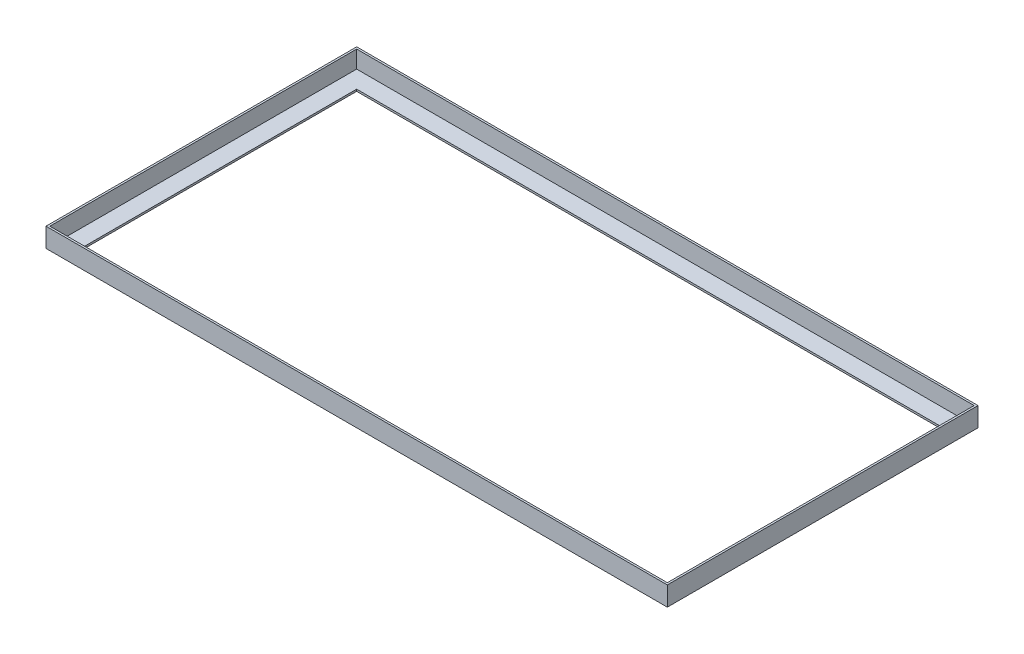
ISO-10303-21;
HEADER;
FILE_DESCRIPTION(('STEP AP214'),'2;1');
FILE_NAME('part.step','',(''),(''),'','','');
FILE_SCHEMA(('AUTOMOTIVE_DESIGN { 1 0 10303 214 1 1 1 1 }'));
ENDSEC;
DATA;
#1=APPLICATION_CONTEXT('core data for automotive mechanical design processes');
#2=APPLICATION_PROTOCOL_DEFINITION('international standard','automotive_design',2000,#1);
#3=PRODUCT_CONTEXT('',#1,'mechanical');
#4=PRODUCT('Part','Part','',(#3));
#5=PRODUCT_RELATED_PRODUCT_CATEGORY('part','',(#4));
#6=PRODUCT_DEFINITION_FORMATION('','',#4);
#7=PRODUCT_DEFINITION_CONTEXT('part definition',#1,'design');
#8=PRODUCT_DEFINITION('design','',#6,#7);
#9=PRODUCT_DEFINITION_SHAPE('','',#8);
#10=(LENGTH_UNIT() NAMED_UNIT(*) SI_UNIT(.MILLI.,.METRE.));
#11=(NAMED_UNIT(*) PLANE_ANGLE_UNIT() SI_UNIT($,.RADIAN.));
#12=(NAMED_UNIT(*) SI_UNIT($,.STERADIAN.) SOLID_ANGLE_UNIT());
#13=UNCERTAINTY_MEASURE_WITH_UNIT(LENGTH_MEASURE(1.E-05),#10,'distance_accuracy_value','');
#14=(GEOMETRIC_REPRESENTATION_CONTEXT(3) GLOBAL_UNCERTAINTY_ASSIGNED_CONTEXT((#13)) GLOBAL_UNIT_ASSIGNED_CONTEXT((#10,
#11,#12)) REPRESENTATION_CONTEXT('',''));
#15=CARTESIAN_POINT('',(0.,0.,0.));
#16=DIRECTION('',(0.,0.,1.));
#17=DIRECTION('',(1.,0.,0.));
#18=AXIS2_PLACEMENT_3D('',#15,#16,#17);
#19=CARTESIAN_POINT('',(0.,50.,-721.65604429409));
#20=DIRECTION('',(0.,0.,-1.));
#21=DIRECTION('',(-1.,0.,0.));
#22=AXIS2_PLACEMENT_3D('',#19,#20,#21);
#23=PLANE('',#22);
#24=DIRECTION('',(0.,-1.,0.));
#25=VECTOR('',#24,1.);
#26=CARTESIAN_POINT('',(-106.818181818182,50.,-721.65604429409));
#27=LINE('',#26,#25);
#28=CARTESIAN_POINT('',(-106.818181818182,50.,-721.65604429409));
#29=VERTEX_POINT('',#28);
#30=CARTESIAN_POINT('',(-106.818181818182,5.,-721.65604429409));
#31=VERTEX_POINT('',#30);
#32=EDGE_CURVE('E136',#29,#31,#27,.T.);
#33=ORIENTED_EDGE('',*,*,#32,.T.);
#34=DIRECTION('',(1.,0.,0.));
#35=VECTOR('',#34,1.);
#36=CARTESIAN_POINT('',(0.,5.,-721.65604429409));
#37=LINE('',#36,#35);
#38=CARTESIAN_POINT('',(1493.18181818182,5.,-721.65604429409));
#39=VERTEX_POINT('',#38);
#40=EDGE_CURVE('E51',#31,#39,#37,.T.);
#41=ORIENTED_EDGE('',*,*,#40,.T.);
#42=DIRECTION('',(0.,-1.,0.));
#43=VECTOR('',#42,1.);
#44=CARTESIAN_POINT('',(1493.18181818182,50.,-721.65604429409));
#45=LINE('',#44,#43);
#46=CARTESIAN_POINT('',(1493.18181818182,50.,-721.65604429409));
#47=VERTEX_POINT('',#46);
#48=EDGE_CURVE('E11',#47,#39,#45,.T.);
#49=ORIENTED_EDGE('',*,*,#48,.F.);
#50=DIRECTION('',(1.,0.,0.));
#51=VECTOR('',#50,1.);
#52=CARTESIAN_POINT('',(0.,50.,-721.65604429409));
#53=LINE('',#52,#51);
#54=EDGE_CURVE('E193',#29,#47,#53,.T.);
#55=ORIENTED_EDGE('',*,*,#54,.F.);
#56=EDGE_LOOP('',(#33,#41,#49,#55));
#57=FACE_BOUND('',#56,.T.);
#58=ADVANCED_FACE('F34',(#57),#23,.F.);
#59=CARTESIAN_POINT('',(1493.18181818182,50.,0.));
#60=DIRECTION('',(1.,0.,0.));
#61=DIRECTION('',(0.,0.,-1.));
#62=AXIS2_PLACEMENT_3D('',#59,#60,#61);
#63=PLANE('',#62);
#64=ORIENTED_EDGE('',*,*,#48,.T.);
#65=DIRECTION('',(0.,0.,1.));
#66=VECTOR('',#65,1.);
#67=CARTESIAN_POINT('',(1493.18181818182,5.,0.));
#68=LINE('',#67,#66);
#69=CARTESIAN_POINT('',(1493.18181818182,5.,73.3439557059103));
#70=VERTEX_POINT('',#69);
#71=EDGE_CURVE('E57',#39,#70,#68,.T.);
#72=ORIENTED_EDGE('',*,*,#71,.T.);
#73=DIRECTION('',(0.,-1.,0.));
#74=VECTOR('',#73,1.);
#75=CARTESIAN_POINT('',(1493.18181818182,50.,73.3439557059103));
#76=LINE('',#75,#74);
#77=CARTESIAN_POINT('',(1493.18181818182,50.,73.3439557059103));
#78=VERTEX_POINT('',#77);
#79=EDGE_CURVE('E43',#78,#70,#76,.T.);
#80=ORIENTED_EDGE('',*,*,#79,.F.);
#81=DIRECTION('',(0.,0.,1.));
#82=VECTOR('',#81,1.);
#83=CARTESIAN_POINT('',(1493.18181818182,50.,0.));
#84=LINE('',#83,#82);
#85=EDGE_CURVE('E196',#47,#78,#84,.T.);
#86=ORIENTED_EDGE('',*,*,#85,.F.);
#87=EDGE_LOOP('',(#64,#72,#80,#86));
#88=FACE_BOUND('',#87,.T.);
#89=ADVANCED_FACE('F243',(#88),#63,.F.);
#90=CARTESIAN_POINT('',(0.,50.,73.3439557059103));
#91=DIRECTION('',(0.,0.,-1.));
#92=DIRECTION('',(-1.,0.,0.));
#93=AXIS2_PLACEMENT_3D('',#90,#91,#92);
#94=PLANE('',#93);
#95=DIRECTION('',(1.,0.,0.));
#96=VECTOR('',#95,1.);
#97=CARTESIAN_POINT('',(0.,5.,73.3439557059103));
#98=LINE('',#97,#96);
#99=CARTESIAN_POINT('',(-106.818181818182,5.,73.3439557059103));
#100=VERTEX_POINT('',#99);
#101=EDGE_CURVE('E139',#100,#70,#98,.T.);
#102=ORIENTED_EDGE('',*,*,#101,.F.);
#103=DIRECTION('',(0.,-1.,0.));
#104=VECTOR('',#103,1.);
#105=CARTESIAN_POINT('',(-106.818181818182,50.,73.3439557059103));
#106=LINE('',#105,#104);
#107=CARTESIAN_POINT('',(-106.818181818182,50.,73.3439557059103));
#108=VERTEX_POINT('',#107);
#109=EDGE_CURVE('E126',#108,#100,#106,.T.);
#110=ORIENTED_EDGE('',*,*,#109,.F.);
#111=DIRECTION('',(1.,0.,0.));
#112=VECTOR('',#111,1.);
#113=CARTESIAN_POINT('',(0.,50.,73.3439557059103));
#114=LINE('',#113,#112);
#115=EDGE_CURVE('E198',#108,#78,#114,.T.);
#116=ORIENTED_EDGE('',*,*,#115,.T.);
#117=ORIENTED_EDGE('',*,*,#79,.T.);
#118=EDGE_LOOP('',(#102,#110,#116,#117));
#119=FACE_BOUND('',#118,.T.);
#120=ADVANCED_FACE('F140',(#119),#94,.T.);
#121=CARTESIAN_POINT('',(1498.18181818182,50.,0.));
#122=DIRECTION('',(1.,0.,0.));
#123=DIRECTION('',(0.,0.,-1.));
#124=AXIS2_PLACEMENT_3D('',#121,#122,#123);
#125=PLANE('',#124);
#126=DIRECTION('',(0.,0.,1.));
#127=VECTOR('',#126,1.);
#128=CARTESIAN_POINT('',(1498.18181818182,0.,0.));
#129=LINE('',#128,#127);
#130=CARTESIAN_POINT('',(1498.18181818182,0.,-726.65604429409));
#131=VERTEX_POINT('',#130);
#132=CARTESIAN_POINT('',(1498.18181818182,0.,78.3439557059103));
#133=VERTEX_POINT('',#132);
#134=EDGE_CURVE('E181',#131,#133,#129,.T.);
#135=ORIENTED_EDGE('',*,*,#134,.F.);
#136=DIRECTION('',(0.,-1.,0.));
#137=VECTOR('',#136,1.);
#138=CARTESIAN_POINT('',(1498.18181818182,50.,-726.65604429409));
#139=LINE('',#138,#137);
#140=CARTESIAN_POINT('',(1498.18181818182,50.,-726.65604429409));
#141=VERTEX_POINT('',#140);
#142=EDGE_CURVE('E38',#141,#131,#139,.T.);
#143=ORIENTED_EDGE('',*,*,#142,.F.);
#144=DIRECTION('',(0.,0.,1.));
#145=VECTOR('',#144,1.);
#146=CARTESIAN_POINT('',(1498.18181818182,50.,0.));
#147=LINE('',#146,#145);
#148=CARTESIAN_POINT('',(1498.18181818182,50.,78.3439557059103));
#149=VERTEX_POINT('',#148);
#150=EDGE_CURVE('E182',#141,#149,#147,.T.);
#151=ORIENTED_EDGE('',*,*,#150,.T.);
#152=DIRECTION('',(0.,-1.,0.));
#153=VECTOR('',#152,1.);
#154=CARTESIAN_POINT('',(1498.18181818182,50.,78.3439557059103));
#155=LINE('',#154,#153);
#156=EDGE_CURVE('E201',#149,#133,#155,.T.);
#157=ORIENTED_EDGE('',*,*,#156,.T.);
#158=EDGE_LOOP('',(#135,#143,#151,#157));
#159=FACE_BOUND('',#158,.T.);
#160=ADVANCED_FACE('F36',(#159),#125,.T.);
#161=CARTESIAN_POINT('',(0.,50.,-726.65604429409));
#162=DIRECTION('',(0.,0.,-1.));
#163=DIRECTION('',(-1.,0.,0.));
#164=AXIS2_PLACEMENT_3D('',#161,#162,#163);
#165=PLANE('',#164);
#166=DIRECTION('',(1.,0.,0.));
#167=VECTOR('',#166,1.);
#168=CARTESIAN_POINT('',(0.,0.,-726.65604429409));
#169=LINE('',#168,#167);
#170=CARTESIAN_POINT('',(-111.818181818182,0.,-726.65604429409));
#171=VERTEX_POINT('',#170);
#172=EDGE_CURVE('E204',#171,#131,#169,.T.);
#173=ORIENTED_EDGE('',*,*,#172,.F.);
#174=DIRECTION('',(0.,-1.,0.));
#175=VECTOR('',#174,1.);
#176=CARTESIAN_POINT('',(-111.818181818182,50.,-726.65604429409));
#177=LINE('',#176,#175);
#178=CARTESIAN_POINT('',(-111.818181818182,50.,-726.65604429409));
#179=VERTEX_POINT('',#178);
#180=EDGE_CURVE('E216',#179,#171,#177,.T.);
#181=ORIENTED_EDGE('',*,*,#180,.F.);
#182=DIRECTION('',(1.,0.,0.));
#183=VECTOR('',#182,1.);
#184=CARTESIAN_POINT('',(0.,50.,-726.65604429409));
#185=LINE('',#184,#183);
#186=EDGE_CURVE('E185',#179,#141,#185,.T.);
#187=ORIENTED_EDGE('',*,*,#186,.T.);
#188=ORIENTED_EDGE('',*,*,#142,.T.);
#189=EDGE_LOOP('',(#173,#181,#187,#188));
#190=FACE_BOUND('',#189,.T.);
#191=ADVANCED_FACE('F223',(#190),#165,.T.);
#192=CARTESIAN_POINT('',(-111.818181818182,50.,0.));
#193=DIRECTION('',(1.,0.,0.));
#194=DIRECTION('',(0.,0.,-1.));
#195=AXIS2_PLACEMENT_3D('',#192,#193,#194);
#196=PLANE('',#195);
#197=DIRECTION('',(0.,0.,1.));
#198=VECTOR('',#197,1.);
#199=CARTESIAN_POINT('',(-111.818181818182,0.,0.));
#200=LINE('',#199,#198);
#201=CARTESIAN_POINT('',(-111.818181818182,0.,78.3439557059103));
#202=VERTEX_POINT('',#201);
#203=EDGE_CURVE('E207',#171,#202,#200,.T.);
#204=ORIENTED_EDGE('',*,*,#203,.T.);
#205=DIRECTION('',(0.,-1.,0.));
#206=VECTOR('',#205,1.);
#207=CARTESIAN_POINT('',(-111.818181818182,50.,78.3439557059103));
#208=LINE('',#207,#206);
#209=CARTESIAN_POINT('',(-111.818181818182,50.,78.3439557059103));
#210=VERTEX_POINT('',#209);
#211=EDGE_CURVE('E214',#210,#202,#208,.T.);
#212=ORIENTED_EDGE('',*,*,#211,.F.);
#213=DIRECTION('',(0.,0.,1.));
#214=VECTOR('',#213,1.);
#215=CARTESIAN_POINT('',(-111.818181818182,50.,0.));
#216=LINE('',#215,#214);
#217=EDGE_CURVE('E189',#179,#210,#216,.T.);
#218=ORIENTED_EDGE('',*,*,#217,.F.);
#219=ORIENTED_EDGE('',*,*,#180,.T.);
#220=EDGE_LOOP('',(#204,#212,#218,#219));
#221=FACE_BOUND('',#220,.T.);
#222=ADVANCED_FACE('F233',(#221),#196,.F.);
#223=CARTESIAN_POINT('',(0.,50.,78.3439557059103));
#224=DIRECTION('',(0.,0.,-1.));
#225=DIRECTION('',(-1.,0.,0.));
#226=AXIS2_PLACEMENT_3D('',#223,#224,#225);
#227=PLANE('',#226);
#228=DIRECTION('',(1.,0.,0.));
#229=VECTOR('',#228,1.);
#230=CARTESIAN_POINT('',(0.,0.,78.3439557059103));
#231=LINE('',#230,#229);
#232=EDGE_CURVE('E186',#202,#133,#231,.T.);
#233=ORIENTED_EDGE('',*,*,#232,.T.);
#234=ORIENTED_EDGE('',*,*,#156,.F.);
#235=DIRECTION('',(1.,0.,0.));
#236=VECTOR('',#235,1.);
#237=CARTESIAN_POINT('',(0.,50.,78.3439557059103));
#238=LINE('',#237,#236);
#239=EDGE_CURVE('E191',#210,#149,#238,.T.);
#240=ORIENTED_EDGE('',*,*,#239,.F.);
#241=ORIENTED_EDGE('',*,*,#211,.T.);
#242=EDGE_LOOP('',(#233,#234,#240,#241));
#243=FACE_BOUND('',#242,.T.);
#244=ADVANCED_FACE('F236',(#243),#227,.F.);
#245=CARTESIAN_POINT('',(-106.818181818182,50.,0.));
#246=DIRECTION('',(1.,0.,0.));
#247=DIRECTION('',(0.,0.,-1.));
#248=AXIS2_PLACEMENT_3D('',#245,#246,#247);
#249=PLANE('',#248);
#250=DIRECTION('',(0.,0.,1.));
#251=VECTOR('',#250,1.);
#252=CARTESIAN_POINT('',(-106.818181818182,5.,0.));
#253=LINE('',#252,#251);
#254=EDGE_CURVE('E130',#31,#100,#253,.T.);
#255=ORIENTED_EDGE('',*,*,#254,.F.);
#256=ORIENTED_EDGE('',*,*,#32,.F.);
#257=DIRECTION('',(0.,0.,1.));
#258=VECTOR('',#257,1.);
#259=CARTESIAN_POINT('',(-106.818181818182,50.,0.));
#260=LINE('',#259,#258);
#261=EDGE_CURVE('E132',#29,#108,#260,.T.);
#262=ORIENTED_EDGE('',*,*,#261,.T.);
#263=ORIENTED_EDGE('',*,*,#109,.T.);
#264=EDGE_LOOP('',(#255,#256,#262,#263));
#265=FACE_BOUND('',#264,.T.);
#266=ADVANCED_FACE('F128',(#265),#249,.T.);
#267=CARTESIAN_POINT('',(0.,50.,0.));
#268=DIRECTION('',(0.,1.,0.));
#269=DIRECTION('',(0.,0.,1.));
#270=AXIS2_PLACEMENT_3D('',#267,#268,#269);
#271=PLANE('',#270);
#272=ORIENTED_EDGE('',*,*,#150,.F.);
#273=ORIENTED_EDGE('',*,*,#186,.F.);
#274=ORIENTED_EDGE('',*,*,#217,.T.);
#275=ORIENTED_EDGE('',*,*,#239,.T.);
#276=EDGE_LOOP('',(#272,#273,#274,#275));
#277=FACE_BOUND('',#276,.T.);
#278=ORIENTED_EDGE('',*,*,#54,.T.);
#279=ORIENTED_EDGE('',*,*,#85,.T.);
#280=ORIENTED_EDGE('',*,*,#115,.F.);
#281=ORIENTED_EDGE('',*,*,#261,.F.);
#282=EDGE_LOOP('',(#278,#279,#280,#281));
#283=FACE_BOUND('',#282,.T.);
#284=ADVANCED_FACE('F238',(#277,#283),#271,.T.);
#285=CARTESIAN_POINT('',(0.,0.,0.));
#286=DIRECTION('',(0.,1.,0.));
#287=DIRECTION('',(0.,0.,1.));
#288=AXIS2_PLACEMENT_3D('',#285,#286,#287);
#289=PLANE('',#288);
#290=ORIENTED_EDGE('',*,*,#134,.T.);
#291=ORIENTED_EDGE('',*,*,#232,.F.);
#292=ORIENTED_EDGE('',*,*,#203,.F.);
#293=ORIENTED_EDGE('',*,*,#172,.T.);
#294=EDGE_LOOP('',(#290,#291,#292,#293));
#295=FACE_BOUND('',#294,.T.);
#296=DIRECTION('',(1.,0.,0.));
#297=VECTOR('',#296,1.);
#298=CARTESIAN_POINT('',(0.,0.,-676.65604429409));
#299=LINE('',#298,#297);
#300=CARTESIAN_POINT('',(-61.818181818182,0.,-676.65604429409));
#301=VERTEX_POINT('',#300);
#302=CARTESIAN_POINT('',(1448.18181818182,0.,-676.65604429409));
#303=VERTEX_POINT('',#302);
#304=EDGE_CURVE('E161',#301,#303,#299,.T.);
#305=ORIENTED_EDGE('',*,*,#304,.F.);
#306=DIRECTION('',(0.,0.,1.));
#307=VECTOR('',#306,1.);
#308=CARTESIAN_POINT('',(-61.8181818181819,0.,0.));
#309=LINE('',#308,#307);
#310=CARTESIAN_POINT('',(-61.8181818181819,0.,28.3439557059103));
#311=VERTEX_POINT('',#310);
#312=EDGE_CURVE('E170',#301,#311,#309,.T.);
#313=ORIENTED_EDGE('',*,*,#312,.T.);
#314=DIRECTION('',(1.,0.,0.));
#315=VECTOR('',#314,1.);
#316=CARTESIAN_POINT('',(0.,0.,28.3439557059103));
#317=LINE('',#316,#315);
#318=CARTESIAN_POINT('',(1448.18181818182,0.,28.3439557059103));
#319=VERTEX_POINT('',#318);
#320=EDGE_CURVE('E167',#311,#319,#317,.T.);
#321=ORIENTED_EDGE('',*,*,#320,.T.);
#322=DIRECTION('',(0.,0.,1.));
#323=VECTOR('',#322,1.);
#324=CARTESIAN_POINT('',(1448.18181818182,0.,0.));
#325=LINE('',#324,#323);
#326=EDGE_CURVE('E164',#303,#319,#325,.T.);
#327=ORIENTED_EDGE('',*,*,#326,.F.);
#328=EDGE_LOOP('',(#305,#313,#321,#327));
#329=FACE_BOUND('',#328,.T.);
#330=ADVANCED_FACE('F230',(#295,#329),#289,.F.);
#331=CARTESIAN_POINT('',(0.,5.,-676.65604429409));
#332=DIRECTION('',(0.,0.,-1.));
#333=DIRECTION('',(-1.,0.,0.));
#334=AXIS2_PLACEMENT_3D('',#331,#332,#333);
#335=PLANE('',#334);
#336=ORIENTED_EDGE('',*,*,#304,.T.);
#337=DIRECTION('',(0.,-1.,0.));
#338=VECTOR('',#337,1.);
#339=CARTESIAN_POINT('',(1448.18181818182,5.,-676.65604429409));
#340=LINE('',#339,#338);
#341=CARTESIAN_POINT('',(1448.18181818182,5.,-676.65604429409));
#342=VERTEX_POINT('',#341);
#343=EDGE_CURVE('E178',#342,#303,#340,.T.);
#344=ORIENTED_EDGE('',*,*,#343,.F.);
#345=DIRECTION('',(1.,0.,0.));
#346=VECTOR('',#345,1.);
#347=CARTESIAN_POINT('',(0.,5.,-676.65604429409));
#348=LINE('',#347,#346);
#349=CARTESIAN_POINT('',(-61.818181818182,5.,-676.65604429409));
#350=VERTEX_POINT('',#349);
#351=EDGE_CURVE('E142',#350,#342,#348,.T.);
#352=ORIENTED_EDGE('',*,*,#351,.F.);
#353=DIRECTION('',(0.,-1.,0.));
#354=VECTOR('',#353,1.);
#355=CARTESIAN_POINT('',(-61.818181818182,5.,-676.65604429409));
#356=LINE('',#355,#354);
#357=EDGE_CURVE('E160',#350,#301,#356,.T.);
#358=ORIENTED_EDGE('',*,*,#357,.T.);
#359=EDGE_LOOP('',(#336,#344,#352,#358));
#360=FACE_BOUND('',#359,.T.);
#361=ADVANCED_FACE('F288',(#360),#335,.F.);
#362=CARTESIAN_POINT('',(1448.18181818182,5.,0.));
#363=DIRECTION('',(1.,0.,0.));
#364=DIRECTION('',(0.,0.,-1.));
#365=AXIS2_PLACEMENT_3D('',#362,#363,#364);
#366=PLANE('',#365);
#367=ORIENTED_EDGE('',*,*,#326,.T.);
#368=DIRECTION('',(0.,-1.,0.));
#369=VECTOR('',#368,1.);
#370=CARTESIAN_POINT('',(1448.18181818182,5.,28.3439557059103));
#371=LINE('',#370,#369);
#372=CARTESIAN_POINT('',(1448.18181818182,5.,28.3439557059103));
#373=VERTEX_POINT('',#372);
#374=EDGE_CURVE('E176',#373,#319,#371,.T.);
#375=ORIENTED_EDGE('',*,*,#374,.F.);
#376=DIRECTION('',(0.,0.,1.));
#377=VECTOR('',#376,1.);
#378=CARTESIAN_POINT('',(1448.18181818182,5.,0.));
#379=LINE('',#378,#377);
#380=EDGE_CURVE('E152',#342,#373,#379,.T.);
#381=ORIENTED_EDGE('',*,*,#380,.F.);
#382=ORIENTED_EDGE('',*,*,#343,.T.);
#383=EDGE_LOOP('',(#367,#375,#381,#382));
#384=FACE_BOUND('',#383,.T.);
#385=ADVANCED_FACE('F298',(#384),#366,.F.);
#386=CARTESIAN_POINT('',(0.,5.,28.3439557059103));
#387=DIRECTION('',(0.,0.,-1.));
#388=DIRECTION('',(-1.,0.,0.));
#389=AXIS2_PLACEMENT_3D('',#386,#387,#388);
#390=PLANE('',#389);
#391=ORIENTED_EDGE('',*,*,#320,.F.);
#392=DIRECTION('',(0.,-1.,0.));
#393=VECTOR('',#392,1.);
#394=CARTESIAN_POINT('',(-61.8181818181819,5.,28.3439557059103));
#395=LINE('',#394,#393);
#396=CARTESIAN_POINT('',(-61.8181818181819,5.,28.3439557059103));
#397=VERTEX_POINT('',#396);
#398=EDGE_CURVE('E174',#397,#311,#395,.T.);
#399=ORIENTED_EDGE('',*,*,#398,.F.);
#400=DIRECTION('',(1.,0.,0.));
#401=VECTOR('',#400,1.);
#402=CARTESIAN_POINT('',(0.,5.,28.3439557059103));
#403=LINE('',#402,#401);
#404=EDGE_CURVE('E154',#397,#373,#403,.T.);
#405=ORIENTED_EDGE('',*,*,#404,.T.);
#406=ORIENTED_EDGE('',*,*,#374,.T.);
#407=EDGE_LOOP('',(#391,#399,#405,#406));
#408=FACE_BOUND('',#407,.T.);
#409=ADVANCED_FACE('F308',(#408),#390,.T.);
#410=CARTESIAN_POINT('',(-61.8181818181819,5.,0.));
#411=DIRECTION('',(1.,0.,0.));
#412=DIRECTION('',(0.,0.,-1.));
#413=AXIS2_PLACEMENT_3D('',#410,#411,#412);
#414=PLANE('',#413);
#415=ORIENTED_EDGE('',*,*,#312,.F.);
#416=ORIENTED_EDGE('',*,*,#357,.F.);
#417=DIRECTION('',(0.,0.,1.));
#418=VECTOR('',#417,1.);
#419=CARTESIAN_POINT('',(-61.8181818181819,5.,0.));
#420=LINE('',#419,#418);
#421=EDGE_CURVE('E157',#350,#397,#420,.T.);
#422=ORIENTED_EDGE('',*,*,#421,.T.);
#423=ORIENTED_EDGE('',*,*,#398,.T.);
#424=EDGE_LOOP('',(#415,#416,#422,#423));
#425=FACE_BOUND('',#424,.T.);
#426=ADVANCED_FACE('F318',(#425),#414,.T.);
#427=CARTESIAN_POINT('',(0.,5.,0.));
#428=DIRECTION('',(0.,1.,0.));
#429=DIRECTION('',(0.,0.,1.));
#430=AXIS2_PLACEMENT_3D('',#427,#428,#429);
#431=PLANE('',#430);
#432=ORIENTED_EDGE('',*,*,#71,.F.);
#433=ORIENTED_EDGE('',*,*,#40,.F.);
#434=ORIENTED_EDGE('',*,*,#254,.T.);
#435=ORIENTED_EDGE('',*,*,#101,.T.);
#436=EDGE_LOOP('',(#432,#433,#434,#435));
#437=FACE_BOUND('',#436,.T.);
#438=ORIENTED_EDGE('',*,*,#351,.T.);
#439=ORIENTED_EDGE('',*,*,#380,.T.);
#440=ORIENTED_EDGE('',*,*,#404,.F.);
#441=ORIENTED_EDGE('',*,*,#421,.F.);
#442=EDGE_LOOP('',(#438,#439,#440,#441));
#443=FACE_BOUND('',#442,.T.);
#444=ADVANCED_FACE('F144',(#437,#443),#431,.T.);
#445=CLOSED_SHELL('',(#58,#89,#120,#160,#191,#222,#244,#266,#284,#330,#361,#385,#409,#426,#444));
#446=MANIFOLD_SOLID_BREP('B2',#445);
#447=ADVANCED_BREP_SHAPE_REPRESENTATION('',(#18,#446),#14);
#448=SHAPE_DEFINITION_REPRESENTATION(#9,#447);
ENDSEC;
END-ISO-10303-21;
